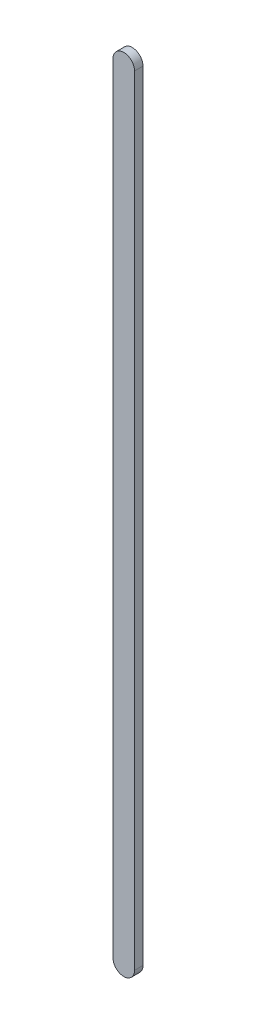
ISO-10303-21;
HEADER;
FILE_DESCRIPTION(('STEP AP214'),'2;1');
FILE_NAME('part.step','',(''),(''),'','','');
FILE_SCHEMA(('AUTOMOTIVE_DESIGN { 1 0 10303 214 1 1 1 1 }'));
ENDSEC;
DATA;
#1=APPLICATION_CONTEXT('core data for automotive mechanical design processes');
#2=APPLICATION_PROTOCOL_DEFINITION('international standard','automotive_design',2000,#1);
#3=PRODUCT_CONTEXT('',#1,'mechanical');
#4=PRODUCT('Part','Part','',(#3));
#5=PRODUCT_RELATED_PRODUCT_CATEGORY('part','',(#4));
#6=PRODUCT_DEFINITION_FORMATION('','',#4);
#7=PRODUCT_DEFINITION_CONTEXT('part definition',#1,'design');
#8=PRODUCT_DEFINITION('design','',#6,#7);
#9=PRODUCT_DEFINITION_SHAPE('','',#8);
#10=(LENGTH_UNIT() NAMED_UNIT(*) SI_UNIT(.MILLI.,.METRE.));
#11=(NAMED_UNIT(*) PLANE_ANGLE_UNIT() SI_UNIT($,.RADIAN.));
#12=(NAMED_UNIT(*) SI_UNIT($,.STERADIAN.) SOLID_ANGLE_UNIT());
#13=UNCERTAINTY_MEASURE_WITH_UNIT(LENGTH_MEASURE(1.E-05),#10,'distance_accuracy_value','');
#14=(GEOMETRIC_REPRESENTATION_CONTEXT(3) GLOBAL_UNCERTAINTY_ASSIGNED_CONTEXT((#13)) GLOBAL_UNIT_ASSIGNED_CONTEXT((#10,
#11,#12)) REPRESENTATION_CONTEXT('',''));
#15=CARTESIAN_POINT('',(0.,0.,0.));
#16=DIRECTION('',(0.,0.,1.));
#17=DIRECTION('',(1.,0.,0.));
#18=AXIS2_PLACEMENT_3D('',#15,#16,#17);
#19=CARTESIAN_POINT('',(154.686,54.0004,0.));
#20=DIRECTION('',(-1.,0.,0.));
#21=DIRECTION('',(0.,1.,0.));
#22=AXIS2_PLACEMENT_3D('',#19,#20,#21);
#23=PLANE('',#22);
#24=DIRECTION('',(0.,1.,0.));
#25=VECTOR('',#24,1.);
#26=CARTESIAN_POINT('',(154.686,54.0004,0.1999996));
#27=LINE('',#26,#25);
#28=CARTESIAN_POINT('',(154.686,54.0004,0.1999996));
#29=VERTEX_POINT('',#28);
#30=CARTESIAN_POINT('',(154.686,72.39,0.1999996));
#31=VERTEX_POINT('',#30);
#32=EDGE_CURVE('E11',#29,#31,#27,.T.);
#33=ORIENTED_EDGE('',*,*,#32,.F.);
#34=DIRECTION('',(0.,0.,1.));
#35=VECTOR('',#34,1.);
#36=CARTESIAN_POINT('',(154.686,54.0004,0.));
#37=LINE('',#36,#35);
#38=CARTESIAN_POINT('',(154.686,54.0004,0.));
#39=VERTEX_POINT('',#38);
#40=EDGE_CURVE('E24',#39,#29,#37,.T.);
#41=ORIENTED_EDGE('',*,*,#40,.F.);
#42=DIRECTION('',(0.,1.,0.));
#43=VECTOR('',#42,1.);
#44=CARTESIAN_POINT('',(154.686,54.0004,0.));
#45=LINE('',#44,#43);
#46=CARTESIAN_POINT('',(154.686,72.39,0.));
#47=VERTEX_POINT('',#46);
#48=EDGE_CURVE('E75',#39,#47,#45,.T.);
#49=ORIENTED_EDGE('',*,*,#48,.T.);
#50=DIRECTION('',(0.,0.,1.));
#51=VECTOR('',#50,1.);
#52=CARTESIAN_POINT('',(154.686,72.39,0.));
#53=LINE('',#52,#51);
#54=EDGE_CURVE('E37',#47,#31,#53,.T.);
#55=ORIENTED_EDGE('',*,*,#54,.T.);
#56=EDGE_LOOP('',(#33,#41,#49,#55));
#57=FACE_BOUND('',#56,.T.);
#58=ADVANCED_FACE('F17',(#57),#23,.F.);
#59=CARTESIAN_POINT('',(154.432,72.39,0.));
#60=DIRECTION('',(0.,0.,-1.));
#61=DIRECTION('',(1.,0.,0.));
#62=AXIS2_PLACEMENT_3D('',#59,#60,#61);
#63=CYLINDRICAL_SURFACE('',#62,0.254000000000005);
#64=CARTESIAN_POINT('',(154.432,72.39,0.1999996));
#65=DIRECTION('',(0.,0.,1.));
#66=DIRECTION('',(1.,0.,0.));
#67=AXIS2_PLACEMENT_3D('',#64,#65,#66);
#68=CIRCLE('',#67,0.254000000000005);
#69=CARTESIAN_POINT('',(154.178,72.39,0.1999996));
#70=VERTEX_POINT('',#69);
#71=EDGE_CURVE('E83',#31,#70,#68,.T.);
#72=ORIENTED_EDGE('',*,*,#71,.F.);
#73=ORIENTED_EDGE('',*,*,#54,.F.);
#74=CARTESIAN_POINT('',(154.432,72.39,0.));
#75=DIRECTION('',(0.,0.,1.));
#76=DIRECTION('',(1.,0.,0.));
#77=AXIS2_PLACEMENT_3D('',#74,#75,#76);
#78=CIRCLE('',#77,0.254000000000005);
#79=CARTESIAN_POINT('',(154.178,72.39,0.));
#80=VERTEX_POINT('',#79);
#81=EDGE_CURVE('E81',#47,#80,#78,.T.);
#82=ORIENTED_EDGE('',*,*,#81,.T.);
#83=DIRECTION('',(0.,0.,1.));
#84=VECTOR('',#83,1.);
#85=CARTESIAN_POINT('',(154.178,72.39,0.));
#86=LINE('',#85,#84);
#87=EDGE_CURVE('E67',#80,#70,#86,.T.);
#88=ORIENTED_EDGE('',*,*,#87,.T.);
#89=EDGE_LOOP('',(#72,#73,#82,#88));
#90=FACE_BOUND('',#89,.T.);
#91=ADVANCED_FACE('F89',(#90),#63,.T.);
#92=CARTESIAN_POINT('',(154.178,72.39,0.));
#93=DIRECTION('',(1.,0.,0.));
#94=DIRECTION('',(0.,-1.,0.));
#95=AXIS2_PLACEMENT_3D('',#92,#93,#94);
#96=PLANE('',#95);
#97=DIRECTION('',(0.,-1.,0.));
#98=VECTOR('',#97,1.);
#99=CARTESIAN_POINT('',(154.178,72.39,0.1999996));
#100=LINE('',#99,#98);
#101=CARTESIAN_POINT('',(154.178,54.0004,0.1999996));
#102=VERTEX_POINT('',#101);
#103=EDGE_CURVE('E71',#70,#102,#100,.T.);
#104=ORIENTED_EDGE('',*,*,#103,.F.);
#105=ORIENTED_EDGE('',*,*,#87,.F.);
#106=DIRECTION('',(0.,-1.,0.));
#107=VECTOR('',#106,1.);
#108=CARTESIAN_POINT('',(154.178,72.39,0.));
#109=LINE('',#108,#107);
#110=CARTESIAN_POINT('',(154.178,54.0004,0.));
#111=VERTEX_POINT('',#110);
#112=EDGE_CURVE('E63',#80,#111,#109,.T.);
#113=ORIENTED_EDGE('',*,*,#112,.T.);
#114=DIRECTION('',(0.,0.,1.));
#115=VECTOR('',#114,1.);
#116=CARTESIAN_POINT('',(154.178,54.0004,0.));
#117=LINE('',#116,#115);
#118=EDGE_CURVE('E53',#111,#102,#117,.T.);
#119=ORIENTED_EDGE('',*,*,#118,.T.);
#120=EDGE_LOOP('',(#104,#105,#113,#119));
#121=FACE_BOUND('',#120,.T.);
#122=ADVANCED_FACE('F66',(#121),#96,.F.);
#123=CARTESIAN_POINT('',(154.432,54.0004,0.));
#124=DIRECTION('',(0.,0.,-1.));
#125=DIRECTION('',(-1.,0.,0.));
#126=AXIS2_PLACEMENT_3D('',#123,#124,#125);
#127=CYLINDRICAL_SURFACE('',#126,0.254000000000003);
#128=CARTESIAN_POINT('',(154.432,54.0004,0.1999996));
#129=DIRECTION('',(0.,0.,1.));
#130=DIRECTION('',(-1.,0.,0.));
#131=AXIS2_PLACEMENT_3D('',#128,#129,#130);
#132=CIRCLE('',#131,0.254000000000003);
#133=EDGE_CURVE('E59',#102,#29,#132,.T.);
#134=ORIENTED_EDGE('',*,*,#133,.F.);
#135=ORIENTED_EDGE('',*,*,#118,.F.);
#136=CARTESIAN_POINT('',(154.432,54.0004,0.));
#137=DIRECTION('',(0.,0.,1.));
#138=DIRECTION('',(-1.,0.,0.));
#139=AXIS2_PLACEMENT_3D('',#136,#137,#138);
#140=CIRCLE('',#139,0.254000000000003);
#141=EDGE_CURVE('E57',#111,#39,#140,.T.);
#142=ORIENTED_EDGE('',*,*,#141,.T.);
#143=ORIENTED_EDGE('',*,*,#40,.T.);
#144=EDGE_LOOP('',(#134,#135,#142,#143));
#145=FACE_BOUND('',#144,.T.);
#146=ADVANCED_FACE('F55',(#145),#127,.T.);
#147=CARTESIAN_POINT('',(154.686,54.0004,0.));
#148=DIRECTION('',(0.,0.,-1.));
#149=DIRECTION('',(-1.,0.,0.));
#150=AXIS2_PLACEMENT_3D('',#147,#148,#149);
#151=PLANE('',#150);
#152=ORIENTED_EDGE('',*,*,#141,.F.);
#153=ORIENTED_EDGE('',*,*,#112,.F.);
#154=ORIENTED_EDGE('',*,*,#81,.F.);
#155=ORIENTED_EDGE('',*,*,#48,.F.);
#156=EDGE_LOOP('',(#152,#153,#154,#155));
#157=FACE_BOUND('',#156,.T.);
#158=ADVANCED_FACE('F74',(#157),#151,.T.);
#159=CARTESIAN_POINT('',(154.686,54.0004,0.1999996));
#160=DIRECTION('',(0.,0.,-1.));
#161=DIRECTION('',(-1.,0.,0.));
#162=AXIS2_PLACEMENT_3D('',#159,#160,#161);
#163=PLANE('',#162);
#164=ORIENTED_EDGE('',*,*,#32,.T.);
#165=ORIENTED_EDGE('',*,*,#71,.T.);
#166=ORIENTED_EDGE('',*,*,#103,.T.);
#167=ORIENTED_EDGE('',*,*,#133,.T.);
#168=EDGE_LOOP('',(#164,#165,#166,#167));
#169=FACE_BOUND('',#168,.T.);
#170=ADVANCED_FACE('F91',(#169),#163,.F.);
#171=CLOSED_SHELL('',(#58,#91,#122,#146,#158,#170));
#172=MANIFOLD_SOLID_BREP('B1',#171);
#173=ADVANCED_BREP_SHAPE_REPRESENTATION('',(#18,#172),#14);
#174=SHAPE_DEFINITION_REPRESENTATION(#9,#173);
ENDSEC;
END-ISO-10303-21;
